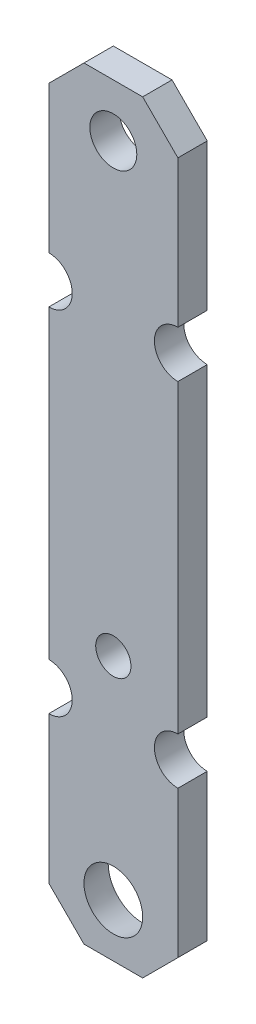
ISO-10303-21;
HEADER;
FILE_DESCRIPTION(('STEP AP214'),'2;1');
FILE_NAME('part.step','',(''),(''),'','','');
FILE_SCHEMA(('AUTOMOTIVE_DESIGN { 1 0 10303 214 1 1 1 1 }'));
ENDSEC;
DATA;
#1=APPLICATION_CONTEXT('core data for automotive mechanical design processes');
#2=APPLICATION_PROTOCOL_DEFINITION('international standard','automotive_design',2000,#1);
#3=PRODUCT_CONTEXT('',#1,'mechanical');
#4=PRODUCT('Part','Part','',(#3));
#5=PRODUCT_RELATED_PRODUCT_CATEGORY('part','',(#4));
#6=PRODUCT_DEFINITION_FORMATION('','',#4);
#7=PRODUCT_DEFINITION_CONTEXT('part definition',#1,'design');
#8=PRODUCT_DEFINITION('design','',#6,#7);
#9=PRODUCT_DEFINITION_SHAPE('','',#8);
#10=(LENGTH_UNIT() NAMED_UNIT(*) SI_UNIT(.MILLI.,.METRE.));
#11=(NAMED_UNIT(*) PLANE_ANGLE_UNIT() SI_UNIT($,.RADIAN.));
#12=(NAMED_UNIT(*) SI_UNIT($,.STERADIAN.) SOLID_ANGLE_UNIT());
#13=UNCERTAINTY_MEASURE_WITH_UNIT(LENGTH_MEASURE(1.E-05),#10,'distance_accuracy_value','');
#14=(GEOMETRIC_REPRESENTATION_CONTEXT(3) GLOBAL_UNCERTAINTY_ASSIGNED_CONTEXT((#13)) GLOBAL_UNIT_ASSIGNED_CONTEXT((#10,
#11,#12)) REPRESENTATION_CONTEXT('',''));
#15=CARTESIAN_POINT('',(0.,0.,0.));
#16=DIRECTION('',(0.,0.,1.));
#17=DIRECTION('',(1.,0.,0.));
#18=AXIS2_PLACEMENT_3D('',#15,#16,#17);
#19=CARTESIAN_POINT('',(11.,30.,5.));
#20=DIRECTION('',(0.,0.,1.));
#21=DIRECTION('',(1.,0.,0.));
#22=AXIS2_PLACEMENT_3D('',#19,#20,#21);
#23=PLANE('',#22);
#24=CARTESIAN_POINT('',(0.,-56.,5.));
#25=DIRECTION('',(0.,0.,-1.));
#26=DIRECTION('',(-1.,0.,0.));
#27=AXIS2_PLACEMENT_3D('',#24,#25,#26);
#28=CIRCLE('',#27,5.);
#29=CARTESIAN_POINT('',(-5.,-56.,5.));
#30=VERTEX_POINT('',#29);
#31=EDGE_CURVE('E365',#30,#30,#28,.T.);
#32=ORIENTED_EDGE('',*,*,#31,.T.);
#33=EDGE_LOOP('',(#32));
#34=FACE_BOUND('',#33,.T.);
#35=CARTESIAN_POINT('',(0.,56.,5.));
#36=DIRECTION('',(0.,0.,1.));
#37=DIRECTION('',(1.,0.,0.));
#38=AXIS2_PLACEMENT_3D('',#35,#36,#37);
#39=CIRCLE('',#38,4.);
#40=CARTESIAN_POINT('',(4.,56.,5.));
#41=VERTEX_POINT('',#40);
#42=EDGE_CURVE('E167',#41,#41,#39,.T.);
#43=ORIENTED_EDGE('',*,*,#42,.F.);
#44=EDGE_LOOP('',(#43));
#45=FACE_BOUND('',#44,.T.);
#46=DIRECTION('',(0.,1.,0.));
#47=VECTOR('',#46,1.);
#48=CARTESIAN_POINT('',(11.,59.,5.));
#49=LINE('',#48,#47);
#50=CARTESIAN_POINT('',(11.,34.,5.));
#51=VERTEX_POINT('',#50);
#52=CARTESIAN_POINT('',(11.,59.,5.));
#53=VERTEX_POINT('',#52);
#54=EDGE_CURVE('E201',#51,#53,#49,.T.);
#55=ORIENTED_EDGE('',*,*,#54,.T.);
#56=DIRECTION('',(-0.707106781186549,0.707106781186546,0.));
#57=VECTOR('',#56,1.);
#58=CARTESIAN_POINT('',(4.99999999999997,65.,5.));
#59=LINE('',#58,#57);
#60=CARTESIAN_POINT('',(4.99999999999997,65.,5.));
#61=VERTEX_POINT('',#60);
#62=EDGE_CURVE('E162',#53,#61,#59,.T.);
#63=ORIENTED_EDGE('',*,*,#62,.T.);
#64=DIRECTION('',(-1.,0.,0.));
#65=VECTOR('',#64,1.);
#66=CARTESIAN_POINT('',(-4.99999999999997,65.,5.));
#67=LINE('',#66,#65);
#68=CARTESIAN_POINT('',(-4.99999999999997,65.,5.));
#69=VERTEX_POINT('',#68);
#70=EDGE_CURVE('E204',#61,#69,#67,.T.);
#71=ORIENTED_EDGE('',*,*,#70,.T.);
#72=DIRECTION('',(-0.707106781186549,-0.707106781186546,0.));
#73=VECTOR('',#72,1.);
#74=CARTESIAN_POINT('',(-4.99999999999997,65.,5.));
#75=LINE('',#74,#73);
#76=CARTESIAN_POINT('',(-11.,59.,5.));
#77=VERTEX_POINT('',#76);
#78=EDGE_CURVE('E206',#69,#77,#75,.T.);
#79=ORIENTED_EDGE('',*,*,#78,.T.);
#80=DIRECTION('',(0.,-1.,0.));
#81=VECTOR('',#80,1.);
#82=CARTESIAN_POINT('',(-11.,59.,5.));
#83=LINE('',#82,#81);
#84=CARTESIAN_POINT('',(-11.,34.,5.));
#85=VERTEX_POINT('',#84);
#86=EDGE_CURVE('E208',#77,#85,#83,.T.);
#87=ORIENTED_EDGE('',*,*,#86,.T.);
#88=CARTESIAN_POINT('',(-11.,30.,5.));
#89=DIRECTION('',(0.,0.,-1.));
#90=DIRECTION('',(-1.,0.,0.));
#91=AXIS2_PLACEMENT_3D('',#88,#89,#90);
#92=CIRCLE('',#91,4.);
#93=CARTESIAN_POINT('',(-11.,26.,5.));
#94=VERTEX_POINT('',#93);
#95=EDGE_CURVE('E210',#85,#94,#92,.T.);
#96=ORIENTED_EDGE('',*,*,#95,.T.);
#97=DIRECTION('',(0.,-1.,0.));
#98=VECTOR('',#97,1.);
#99=CARTESIAN_POINT('',(-11.,26.,5.));
#100=LINE('',#99,#98);
#101=CARTESIAN_POINT('',(-11.,-26.,5.));
#102=VERTEX_POINT('',#101);
#103=EDGE_CURVE('E212',#94,#102,#100,.T.);
#104=ORIENTED_EDGE('',*,*,#103,.T.);
#105=CARTESIAN_POINT('',(-11.,-30.,5.));
#106=DIRECTION('',(0.,0.,-1.));
#107=DIRECTION('',(1.,0.,0.));
#108=AXIS2_PLACEMENT_3D('',#105,#106,#107);
#109=CIRCLE('',#108,4.);
#110=CARTESIAN_POINT('',(-11.,-34.,5.));
#111=VERTEX_POINT('',#110);
#112=EDGE_CURVE('E214',#102,#111,#109,.T.);
#113=ORIENTED_EDGE('',*,*,#112,.T.);
#114=DIRECTION('',(0.,-1.,0.));
#115=VECTOR('',#114,1.);
#116=CARTESIAN_POINT('',(-11.,-59.,5.));
#117=LINE('',#116,#115);
#118=CARTESIAN_POINT('',(-11.,-59.,5.));
#119=VERTEX_POINT('',#118);
#120=EDGE_CURVE('E216',#111,#119,#117,.T.);
#121=ORIENTED_EDGE('',*,*,#120,.T.);
#122=DIRECTION('',(0.707106781186549,-0.707106781186546,0.));
#123=VECTOR('',#122,1.);
#124=CARTESIAN_POINT('',(-4.99999999999997,-65.,5.));
#125=LINE('',#124,#123);
#126=CARTESIAN_POINT('',(-4.99999999999997,-65.,5.));
#127=VERTEX_POINT('',#126);
#128=EDGE_CURVE('E218',#119,#127,#125,.T.);
#129=ORIENTED_EDGE('',*,*,#128,.T.);
#130=DIRECTION('',(1.,0.,0.));
#131=VECTOR('',#130,1.);
#132=CARTESIAN_POINT('',(-4.99999999999997,-65.,5.));
#133=LINE('',#132,#131);
#134=CARTESIAN_POINT('',(4.99999999999997,-65.,5.));
#135=VERTEX_POINT('',#134);
#136=EDGE_CURVE('E220',#127,#135,#133,.T.);
#137=ORIENTED_EDGE('',*,*,#136,.T.);
#138=DIRECTION('',(0.707106781186549,0.707106781186546,0.));
#139=VECTOR('',#138,1.);
#140=CARTESIAN_POINT('',(4.99999999999997,-65.,5.));
#141=LINE('',#140,#139);
#142=CARTESIAN_POINT('',(11.,-59.,5.));
#143=VERTEX_POINT('',#142);
#144=EDGE_CURVE('E222',#135,#143,#141,.T.);
#145=ORIENTED_EDGE('',*,*,#144,.T.);
#146=DIRECTION('',(0.,1.,0.));
#147=VECTOR('',#146,1.);
#148=CARTESIAN_POINT('',(11.,-59.,5.));
#149=LINE('',#148,#147);
#150=CARTESIAN_POINT('',(11.,-34.,5.));
#151=VERTEX_POINT('',#150);
#152=EDGE_CURVE('E224',#143,#151,#149,.T.);
#153=ORIENTED_EDGE('',*,*,#152,.T.);
#154=CARTESIAN_POINT('',(11.,-30.,5.));
#155=DIRECTION('',(0.,0.,-1.));
#156=DIRECTION('',(-1.,0.,0.));
#157=AXIS2_PLACEMENT_3D('',#154,#155,#156);
#158=CIRCLE('',#157,4.);
#159=CARTESIAN_POINT('',(11.,-26.,5.));
#160=VERTEX_POINT('',#159);
#161=EDGE_CURVE('E226',#151,#160,#158,.T.);
#162=ORIENTED_EDGE('',*,*,#161,.T.);
#163=DIRECTION('',(0.,1.,0.));
#164=VECTOR('',#163,1.);
#165=CARTESIAN_POINT('',(11.,26.,5.));
#166=LINE('',#165,#164);
#167=CARTESIAN_POINT('',(11.,26.,5.));
#168=VERTEX_POINT('',#167);
#169=EDGE_CURVE('E55',#160,#168,#166,.T.);
#170=ORIENTED_EDGE('',*,*,#169,.T.);
#171=CARTESIAN_POINT('',(11.,30.,5.));
#172=DIRECTION('',(0.,0.,-1.));
#173=DIRECTION('',(1.,0.,0.));
#174=AXIS2_PLACEMENT_3D('',#171,#172,#173);
#175=CIRCLE('',#174,4.);
#176=EDGE_CURVE('E50',#168,#51,#175,.T.);
#177=ORIENTED_EDGE('',*,*,#176,.T.);
#178=EDGE_LOOP('',(#55,#63,#71,#79,#87,#96,#104,#113,#121,#129,#137,#145,#153,#162,#170,#177));
#179=FACE_BOUND('',#178,.T.);
#180=CARTESIAN_POINT('',(0.,-20.,5.));
#181=DIRECTION('',(0.,0.,1.));
#182=DIRECTION('',(1.,0.,0.));
#183=AXIS2_PLACEMENT_3D('',#180,#181,#182);
#184=CIRCLE('',#183,3.);
#185=CARTESIAN_POINT('',(3.,-20.,5.));
#186=VERTEX_POINT('',#185);
#187=EDGE_CURVE('E372',#186,#186,#184,.T.);
#188=ORIENTED_EDGE('',*,*,#187,.F.);
#189=EDGE_LOOP('',(#188));
#190=FACE_BOUND('',#189,.T.);
#191=ADVANCED_FACE('F35',(#34,#45,#179,#190),#23,.T.);
#192=CARTESIAN_POINT('',(11.,30.,0.));
#193=DIRECTION('',(0.,0.,1.));
#194=DIRECTION('',(1.,0.,0.));
#195=AXIS2_PLACEMENT_3D('',#192,#193,#194);
#196=PLANE('',#195);
#197=CARTESIAN_POINT('',(0.,-56.,0.));
#198=DIRECTION('',(0.,0.,-1.));
#199=DIRECTION('',(-1.,0.,0.));
#200=AXIS2_PLACEMENT_3D('',#197,#198,#199);
#201=CIRCLE('',#200,5.88163490354229);
#202=CARTESIAN_POINT('',(-5.88163490354229,-56.,0.));
#203=VERTEX_POINT('',#202);
#204=EDGE_CURVE('E368',#203,#203,#201,.T.);
#205=ORIENTED_EDGE('',*,*,#204,.F.);
#206=EDGE_LOOP('',(#205));
#207=FACE_BOUND('',#206,.T.);
#208=CARTESIAN_POINT('',(0.,56.,0.));
#209=DIRECTION('',(0.,0.,1.));
#210=DIRECTION('',(1.,0.,0.));
#211=AXIS2_PLACEMENT_3D('',#208,#209,#210);
#212=CIRCLE('',#211,4.);
#213=CARTESIAN_POINT('',(4.,56.,0.));
#214=VERTEX_POINT('',#213);
#215=EDGE_CURVE('E170',#214,#214,#212,.T.);
#216=ORIENTED_EDGE('',*,*,#215,.T.);
#217=EDGE_LOOP('',(#216));
#218=FACE_BOUND('',#217,.T.);
#219=DIRECTION('',(0.,1.,0.));
#220=VECTOR('',#219,1.);
#221=CARTESIAN_POINT('',(11.,59.,0.));
#222=LINE('',#221,#220);
#223=CARTESIAN_POINT('',(11.,34.,0.));
#224=VERTEX_POINT('',#223);
#225=CARTESIAN_POINT('',(11.,59.,0.));
#226=VERTEX_POINT('',#225);
#227=EDGE_CURVE('E153',#224,#226,#222,.T.);
#228=ORIENTED_EDGE('',*,*,#227,.F.);
#229=CARTESIAN_POINT('',(11.,30.,0.));
#230=DIRECTION('',(0.,0.,-1.));
#231=DIRECTION('',(1.,0.,0.));
#232=AXIS2_PLACEMENT_3D('',#229,#230,#231);
#233=CIRCLE('',#232,4.);
#234=CARTESIAN_POINT('',(11.,26.,0.));
#235=VERTEX_POINT('',#234);
#236=EDGE_CURVE('E199',#235,#224,#233,.T.);
#237=ORIENTED_EDGE('',*,*,#236,.F.);
#238=DIRECTION('',(0.,1.,0.));
#239=VECTOR('',#238,1.);
#240=CARTESIAN_POINT('',(11.,26.,0.));
#241=LINE('',#240,#239);
#242=CARTESIAN_POINT('',(11.,-26.,0.));
#243=VERTEX_POINT('',#242);
#244=EDGE_CURVE('E197',#243,#235,#241,.T.);
#245=ORIENTED_EDGE('',*,*,#244,.F.);
#246=CARTESIAN_POINT('',(11.,-30.,0.));
#247=DIRECTION('',(0.,0.,-1.));
#248=DIRECTION('',(-1.,0.,0.));
#249=AXIS2_PLACEMENT_3D('',#246,#247,#248);
#250=CIRCLE('',#249,4.);
#251=CARTESIAN_POINT('',(11.,-34.,0.));
#252=VERTEX_POINT('',#251);
#253=EDGE_CURVE('E195',#252,#243,#250,.T.);
#254=ORIENTED_EDGE('',*,*,#253,.F.);
#255=DIRECTION('',(0.,1.,0.));
#256=VECTOR('',#255,1.);
#257=CARTESIAN_POINT('',(11.,-59.,0.));
#258=LINE('',#257,#256);
#259=CARTESIAN_POINT('',(11.,-59.,0.));
#260=VERTEX_POINT('',#259);
#261=EDGE_CURVE('E193',#260,#252,#258,.T.);
#262=ORIENTED_EDGE('',*,*,#261,.F.);
#263=DIRECTION('',(0.707106781186549,0.707106781186546,0.));
#264=VECTOR('',#263,1.);
#265=CARTESIAN_POINT('',(4.99999999999997,-65.,0.));
#266=LINE('',#265,#264);
#267=CARTESIAN_POINT('',(4.99999999999997,-65.,0.));
#268=VERTEX_POINT('',#267);
#269=EDGE_CURVE('E191',#268,#260,#266,.T.);
#270=ORIENTED_EDGE('',*,*,#269,.F.);
#271=DIRECTION('',(1.,0.,0.));
#272=VECTOR('',#271,1.);
#273=CARTESIAN_POINT('',(-4.99999999999997,-65.,0.));
#274=LINE('',#273,#272);
#275=CARTESIAN_POINT('',(-4.99999999999997,-65.,0.));
#276=VERTEX_POINT('',#275);
#277=EDGE_CURVE('E189',#276,#268,#274,.T.);
#278=ORIENTED_EDGE('',*,*,#277,.F.);
#279=DIRECTION('',(0.707106781186549,-0.707106781186546,0.));
#280=VECTOR('',#279,1.);
#281=CARTESIAN_POINT('',(-4.99999999999997,-65.,0.));
#282=LINE('',#281,#280);
#283=CARTESIAN_POINT('',(-11.,-59.,0.));
#284=VERTEX_POINT('',#283);
#285=EDGE_CURVE('E187',#284,#276,#282,.T.);
#286=ORIENTED_EDGE('',*,*,#285,.F.);
#287=DIRECTION('',(0.,-1.,0.));
#288=VECTOR('',#287,1.);
#289=CARTESIAN_POINT('',(-11.,-59.,0.));
#290=LINE('',#289,#288);
#291=CARTESIAN_POINT('',(-11.,-34.,0.));
#292=VERTEX_POINT('',#291);
#293=EDGE_CURVE('E185',#292,#284,#290,.T.);
#294=ORIENTED_EDGE('',*,*,#293,.F.);
#295=CARTESIAN_POINT('',(-11.,-30.,0.));
#296=DIRECTION('',(0.,0.,-1.));
#297=DIRECTION('',(1.,0.,0.));
#298=AXIS2_PLACEMENT_3D('',#295,#296,#297);
#299=CIRCLE('',#298,4.);
#300=CARTESIAN_POINT('',(-11.,-26.,0.));
#301=VERTEX_POINT('',#300);
#302=EDGE_CURVE('E183',#301,#292,#299,.T.);
#303=ORIENTED_EDGE('',*,*,#302,.F.);
#304=DIRECTION('',(0.,-1.,0.));
#305=VECTOR('',#304,1.);
#306=CARTESIAN_POINT('',(-11.,26.,0.));
#307=LINE('',#306,#305);
#308=CARTESIAN_POINT('',(-11.,26.,0.));
#309=VERTEX_POINT('',#308);
#310=EDGE_CURVE('E181',#309,#301,#307,.T.);
#311=ORIENTED_EDGE('',*,*,#310,.F.);
#312=CARTESIAN_POINT('',(-11.,30.,0.));
#313=DIRECTION('',(0.,0.,-1.));
#314=DIRECTION('',(-1.,0.,0.));
#315=AXIS2_PLACEMENT_3D('',#312,#313,#314);
#316=CIRCLE('',#315,4.);
#317=CARTESIAN_POINT('',(-11.,34.,0.));
#318=VERTEX_POINT('',#317);
#319=EDGE_CURVE('E179',#318,#309,#316,.T.);
#320=ORIENTED_EDGE('',*,*,#319,.F.);
#321=DIRECTION('',(0.,-1.,0.));
#322=VECTOR('',#321,1.);
#323=CARTESIAN_POINT('',(-11.,59.,0.));
#324=LINE('',#323,#322);
#325=CARTESIAN_POINT('',(-11.,59.,0.));
#326=VERTEX_POINT('',#325);
#327=EDGE_CURVE('E177',#326,#318,#324,.T.);
#328=ORIENTED_EDGE('',*,*,#327,.F.);
#329=DIRECTION('',(-0.707106781186549,-0.707106781186546,0.));
#330=VECTOR('',#329,1.);
#331=CARTESIAN_POINT('',(-4.99999999999997,65.,0.));
#332=LINE('',#331,#330);
#333=CARTESIAN_POINT('',(-4.99999999999997,65.,0.));
#334=VERTEX_POINT('',#333);
#335=EDGE_CURVE('E175',#334,#326,#332,.T.);
#336=ORIENTED_EDGE('',*,*,#335,.F.);
#337=DIRECTION('',(-1.,0.,0.));
#338=VECTOR('',#337,1.);
#339=CARTESIAN_POINT('',(-4.99999999999997,65.,0.));
#340=LINE('',#339,#338);
#341=CARTESIAN_POINT('',(4.99999999999997,65.,0.));
#342=VERTEX_POINT('',#341);
#343=EDGE_CURVE('E155',#342,#334,#340,.T.);
#344=ORIENTED_EDGE('',*,*,#343,.F.);
#345=DIRECTION('',(-0.707106781186549,0.707106781186546,0.));
#346=VECTOR('',#345,1.);
#347=CARTESIAN_POINT('',(4.99999999999997,65.,0.));
#348=LINE('',#347,#346);
#349=EDGE_CURVE('E148',#226,#342,#348,.T.);
#350=ORIENTED_EDGE('',*,*,#349,.F.);
#351=EDGE_LOOP('',(#228,#237,#245,#254,#262,#270,#278,#286,#294,#303,#311,#320,#328,#336,#344,#350));
#352=FACE_BOUND('',#351,.T.);
#353=CARTESIAN_POINT('',(0.,-20.,0.));
#354=DIRECTION('',(0.,0.,1.));
#355=DIRECTION('',(1.,0.,0.));
#356=AXIS2_PLACEMENT_3D('',#353,#354,#355);
#357=CIRCLE('',#356,3.);
#358=CARTESIAN_POINT('',(3.,-20.,0.));
#359=VERTEX_POINT('',#358);
#360=EDGE_CURVE('E369',#359,#359,#357,.T.);
#361=ORIENTED_EDGE('',*,*,#360,.T.);
#362=EDGE_LOOP('',(#361));
#363=FACE_BOUND('',#362,.T.);
#364=ADVANCED_FACE('F149',(#207,#218,#352,#363),#196,.F.);
#365=CARTESIAN_POINT('',(11.,59.,5.));
#366=DIRECTION('',(-1.,0.,0.));
#367=DIRECTION('',(0.,-1.,0.));
#368=AXIS2_PLACEMENT_3D('',#365,#366,#367);
#369=PLANE('',#368);
#370=ORIENTED_EDGE('',*,*,#227,.T.);
#371=DIRECTION('',(0.,0.,-1.));
#372=VECTOR('',#371,1.);
#373=CARTESIAN_POINT('',(11.,59.,5.));
#374=LINE('',#373,#372);
#375=EDGE_CURVE('E11',#53,#226,#374,.T.);
#376=ORIENTED_EDGE('',*,*,#375,.F.);
#377=ORIENTED_EDGE('',*,*,#54,.F.);
#378=DIRECTION('',(0.,0.,-1.));
#379=VECTOR('',#378,1.);
#380=CARTESIAN_POINT('',(11.,34.,5.));
#381=LINE('',#380,#379);
#382=EDGE_CURVE('E166',#51,#224,#381,.T.);
#383=ORIENTED_EDGE('',*,*,#382,.T.);
#384=EDGE_LOOP('',(#370,#376,#377,#383));
#385=FACE_BOUND('',#384,.T.);
#386=ADVANCED_FACE('F37',(#385),#369,.F.);
#387=CARTESIAN_POINT('',(4.99999999999997,65.,5.));
#388=DIRECTION('',(-0.707106781186546,-0.707106781186549,0.));
#389=DIRECTION('',(0.707106781186549,-0.707106781186546,0.));
#390=AXIS2_PLACEMENT_3D('',#387,#388,#389);
#391=PLANE('',#390);
#392=ORIENTED_EDGE('',*,*,#349,.T.);
#393=DIRECTION('',(0.,0.,-1.));
#394=VECTOR('',#393,1.);
#395=CARTESIAN_POINT('',(4.99999999999997,65.,5.));
#396=LINE('',#395,#394);
#397=EDGE_CURVE('E43',#61,#342,#396,.T.);
#398=ORIENTED_EDGE('',*,*,#397,.F.);
#399=ORIENTED_EDGE('',*,*,#62,.F.);
#400=ORIENTED_EDGE('',*,*,#375,.T.);
#401=EDGE_LOOP('',(#392,#398,#399,#400));
#402=FACE_BOUND('',#401,.T.);
#403=ADVANCED_FACE('F161',(#402),#391,.F.);
#404=CARTESIAN_POINT('',(-4.99999999999997,65.,5.));
#405=DIRECTION('',(0.,-1.,0.));
#406=DIRECTION('',(0.,0.,-1.));
#407=AXIS2_PLACEMENT_3D('',#404,#405,#406);
#408=PLANE('',#407);
#409=ORIENTED_EDGE('',*,*,#343,.T.);
#410=DIRECTION('',(0.,0.,-1.));
#411=VECTOR('',#410,1.);
#412=CARTESIAN_POINT('',(-4.99999999999997,65.,5.));
#413=LINE('',#412,#411);
#414=EDGE_CURVE('E267',#69,#334,#413,.T.);
#415=ORIENTED_EDGE('',*,*,#414,.F.);
#416=ORIENTED_EDGE('',*,*,#70,.F.);
#417=ORIENTED_EDGE('',*,*,#397,.T.);
#418=EDGE_LOOP('',(#409,#415,#416,#417));
#419=FACE_BOUND('',#418,.T.);
#420=ADVANCED_FACE('F271',(#419),#408,.F.);
#421=CARTESIAN_POINT('',(-4.99999999999997,65.,5.));
#422=DIRECTION('',(0.707106781186546,-0.707106781186549,0.));
#423=DIRECTION('',(0.707106781186549,0.707106781186546,0.));
#424=AXIS2_PLACEMENT_3D('',#421,#422,#423);
#425=PLANE('',#424);
#426=ORIENTED_EDGE('',*,*,#335,.T.);
#427=DIRECTION('',(0.,0.,-1.));
#428=VECTOR('',#427,1.);
#429=CARTESIAN_POINT('',(-11.,59.,5.));
#430=LINE('',#429,#428);
#431=EDGE_CURVE('E264',#77,#326,#430,.T.);
#432=ORIENTED_EDGE('',*,*,#431,.F.);
#433=ORIENTED_EDGE('',*,*,#78,.F.);
#434=ORIENTED_EDGE('',*,*,#414,.T.);
#435=EDGE_LOOP('',(#426,#432,#433,#434));
#436=FACE_BOUND('',#435,.T.);
#437=ADVANCED_FACE('F279',(#436),#425,.F.);
#438=CARTESIAN_POINT('',(-11.,59.,5.));
#439=DIRECTION('',(1.,0.,0.));
#440=DIRECTION('',(0.,1.,0.));
#441=AXIS2_PLACEMENT_3D('',#438,#439,#440);
#442=PLANE('',#441);
#443=ORIENTED_EDGE('',*,*,#327,.T.);
#444=DIRECTION('',(0.,0.,-1.));
#445=VECTOR('',#444,1.);
#446=CARTESIAN_POINT('',(-11.,34.,5.));
#447=LINE('',#446,#445);
#448=EDGE_CURVE('E261',#85,#318,#447,.T.);
#449=ORIENTED_EDGE('',*,*,#448,.F.);
#450=ORIENTED_EDGE('',*,*,#86,.F.);
#451=ORIENTED_EDGE('',*,*,#431,.T.);
#452=EDGE_LOOP('',(#443,#449,#450,#451));
#453=FACE_BOUND('',#452,.T.);
#454=ADVANCED_FACE('F282',(#453),#442,.F.);
#455=CARTESIAN_POINT('',(-11.,30.,5.));
#456=DIRECTION('',(0.,0.,-1.));
#457=DIRECTION('',(-1.,0.,0.));
#458=AXIS2_PLACEMENT_3D('',#455,#456,#457);
#459=CYLINDRICAL_SURFACE('',#458,4.);
#460=ORIENTED_EDGE('',*,*,#319,.T.);
#461=DIRECTION('',(0.,0.,-1.));
#462=VECTOR('',#461,1.);
#463=CARTESIAN_POINT('',(-11.,26.,5.));
#464=LINE('',#463,#462);
#465=EDGE_CURVE('E258',#94,#309,#464,.T.);
#466=ORIENTED_EDGE('',*,*,#465,.F.);
#467=ORIENTED_EDGE('',*,*,#95,.F.);
#468=ORIENTED_EDGE('',*,*,#448,.T.);
#469=EDGE_LOOP('',(#460,#466,#467,#468));
#470=FACE_BOUND('',#469,.T.);
#471=ADVANCED_FACE('F287',(#470),#459,.F.);
#472=CARTESIAN_POINT('',(-11.,26.,5.));
#473=DIRECTION('',(1.,0.,0.));
#474=DIRECTION('',(0.,0.,-1.));
#475=AXIS2_PLACEMENT_3D('',#472,#473,#474);
#476=PLANE('',#475);
#477=ORIENTED_EDGE('',*,*,#310,.T.);
#478=DIRECTION('',(0.,0.,-1.));
#479=VECTOR('',#478,1.);
#480=CARTESIAN_POINT('',(-11.,-26.,5.));
#481=LINE('',#480,#479);
#482=EDGE_CURVE('E255',#102,#301,#481,.T.);
#483=ORIENTED_EDGE('',*,*,#482,.F.);
#484=ORIENTED_EDGE('',*,*,#103,.F.);
#485=ORIENTED_EDGE('',*,*,#465,.T.);
#486=EDGE_LOOP('',(#477,#483,#484,#485));
#487=FACE_BOUND('',#486,.T.);
#488=ADVANCED_FACE('F293',(#487),#476,.F.);
#489=CARTESIAN_POINT('',(-11.,-30.,5.));
#490=DIRECTION('',(0.,0.,-1.));
#491=DIRECTION('',(-1.,0.,0.));
#492=AXIS2_PLACEMENT_3D('',#489,#490,#491);
#493=CYLINDRICAL_SURFACE('',#492,4.);
#494=ORIENTED_EDGE('',*,*,#302,.T.);
#495=DIRECTION('',(0.,0.,-1.));
#496=VECTOR('',#495,1.);
#497=CARTESIAN_POINT('',(-11.,-34.,5.));
#498=LINE('',#497,#496);
#499=EDGE_CURVE('E252',#111,#292,#498,.T.);
#500=ORIENTED_EDGE('',*,*,#499,.F.);
#501=ORIENTED_EDGE('',*,*,#112,.F.);
#502=ORIENTED_EDGE('',*,*,#482,.T.);
#503=EDGE_LOOP('',(#494,#500,#501,#502));
#504=FACE_BOUND('',#503,.T.);
#505=ADVANCED_FACE('F297',(#504),#493,.F.);
#506=CARTESIAN_POINT('',(-11.,-59.,5.));
#507=DIRECTION('',(1.,0.,0.));
#508=DIRECTION('',(0.,1.,0.));
#509=AXIS2_PLACEMENT_3D('',#506,#507,#508);
#510=PLANE('',#509);
#511=ORIENTED_EDGE('',*,*,#293,.T.);
#512=DIRECTION('',(0.,0.,-1.));
#513=VECTOR('',#512,1.);
#514=CARTESIAN_POINT('',(-11.,-59.,5.));
#515=LINE('',#514,#513);
#516=EDGE_CURVE('E249',#119,#284,#515,.T.);
#517=ORIENTED_EDGE('',*,*,#516,.F.);
#518=ORIENTED_EDGE('',*,*,#120,.F.);
#519=ORIENTED_EDGE('',*,*,#499,.T.);
#520=EDGE_LOOP('',(#511,#517,#518,#519));
#521=FACE_BOUND('',#520,.T.);
#522=ADVANCED_FACE('F302',(#521),#510,.F.);
#523=CARTESIAN_POINT('',(-4.99999999999997,-65.,5.));
#524=DIRECTION('',(0.707106781186546,0.707106781186549,0.));
#525=DIRECTION('',(-0.707106781186549,0.707106781186546,0.));
#526=AXIS2_PLACEMENT_3D('',#523,#524,#525);
#527=PLANE('',#526);
#528=ORIENTED_EDGE('',*,*,#285,.T.);
#529=DIRECTION('',(0.,0.,-1.));
#530=VECTOR('',#529,1.);
#531=CARTESIAN_POINT('',(-4.99999999999997,-65.,5.));
#532=LINE('',#531,#530);
#533=EDGE_CURVE('E246',#127,#276,#532,.T.);
#534=ORIENTED_EDGE('',*,*,#533,.F.);
#535=ORIENTED_EDGE('',*,*,#128,.F.);
#536=ORIENTED_EDGE('',*,*,#516,.T.);
#537=EDGE_LOOP('',(#528,#534,#535,#536));
#538=FACE_BOUND('',#537,.T.);
#539=ADVANCED_FACE('F308',(#538),#527,.F.);
#540=CARTESIAN_POINT('',(-4.99999999999997,-65.,5.));
#541=DIRECTION('',(0.,1.,0.));
#542=DIRECTION('',(0.,0.,1.));
#543=AXIS2_PLACEMENT_3D('',#540,#541,#542);
#544=PLANE('',#543);
#545=ORIENTED_EDGE('',*,*,#277,.T.);
#546=DIRECTION('',(0.,0.,-1.));
#547=VECTOR('',#546,1.);
#548=CARTESIAN_POINT('',(4.99999999999997,-65.,5.));
#549=LINE('',#548,#547);
#550=EDGE_CURVE('E243',#135,#268,#549,.T.);
#551=ORIENTED_EDGE('',*,*,#550,.F.);
#552=ORIENTED_EDGE('',*,*,#136,.F.);
#553=ORIENTED_EDGE('',*,*,#533,.T.);
#554=EDGE_LOOP('',(#545,#551,#552,#553));
#555=FACE_BOUND('',#554,.T.);
#556=ADVANCED_FACE('F312',(#555),#544,.F.);
#557=CARTESIAN_POINT('',(4.99999999999997,-65.,5.));
#558=DIRECTION('',(-0.707106781186546,0.707106781186549,0.));
#559=DIRECTION('',(-0.707106781186549,-0.707106781186546,0.));
#560=AXIS2_PLACEMENT_3D('',#557,#558,#559);
#561=PLANE('',#560);
#562=ORIENTED_EDGE('',*,*,#269,.T.);
#563=DIRECTION('',(0.,0.,-1.));
#564=VECTOR('',#563,1.);
#565=CARTESIAN_POINT('',(11.,-59.,5.));
#566=LINE('',#565,#564);
#567=EDGE_CURVE('E240',#143,#260,#566,.T.);
#568=ORIENTED_EDGE('',*,*,#567,.F.);
#569=ORIENTED_EDGE('',*,*,#144,.F.);
#570=ORIENTED_EDGE('',*,*,#550,.T.);
#571=EDGE_LOOP('',(#562,#568,#569,#570));
#572=FACE_BOUND('',#571,.T.);
#573=ADVANCED_FACE('F317',(#572),#561,.F.);
#574=CARTESIAN_POINT('',(11.,-59.,5.));
#575=DIRECTION('',(-1.,0.,0.));
#576=DIRECTION('',(0.,-1.,0.));
#577=AXIS2_PLACEMENT_3D('',#574,#575,#576);
#578=PLANE('',#577);
#579=ORIENTED_EDGE('',*,*,#261,.T.);
#580=DIRECTION('',(0.,0.,-1.));
#581=VECTOR('',#580,1.);
#582=CARTESIAN_POINT('',(11.,-34.,5.));
#583=LINE('',#582,#581);
#584=EDGE_CURVE('E237',#151,#252,#583,.T.);
#585=ORIENTED_EDGE('',*,*,#584,.F.);
#586=ORIENTED_EDGE('',*,*,#152,.F.);
#587=ORIENTED_EDGE('',*,*,#567,.T.);
#588=EDGE_LOOP('',(#579,#585,#586,#587));
#589=FACE_BOUND('',#588,.T.);
#590=ADVANCED_FACE('F323',(#589),#578,.F.);
#591=CARTESIAN_POINT('',(11.,-30.,5.));
#592=DIRECTION('',(0.,0.,-1.));
#593=DIRECTION('',(-1.,0.,0.));
#594=AXIS2_PLACEMENT_3D('',#591,#592,#593);
#595=CYLINDRICAL_SURFACE('',#594,4.);
#596=ORIENTED_EDGE('',*,*,#253,.T.);
#597=DIRECTION('',(0.,0.,-1.));
#598=VECTOR('',#597,1.);
#599=CARTESIAN_POINT('',(11.,-26.,5.));
#600=LINE('',#599,#598);
#601=EDGE_CURVE('E234',#160,#243,#600,.T.);
#602=ORIENTED_EDGE('',*,*,#601,.F.);
#603=ORIENTED_EDGE('',*,*,#161,.F.);
#604=ORIENTED_EDGE('',*,*,#584,.T.);
#605=EDGE_LOOP('',(#596,#602,#603,#604));
#606=FACE_BOUND('',#605,.T.);
#607=ADVANCED_FACE('F327',(#606),#595,.F.);
#608=CARTESIAN_POINT('',(11.,26.,5.));
#609=DIRECTION('',(-1.,0.,0.));
#610=DIRECTION('',(0.,0.,1.));
#611=AXIS2_PLACEMENT_3D('',#608,#609,#610);
#612=PLANE('',#611);
#613=ORIENTED_EDGE('',*,*,#244,.T.);
#614=DIRECTION('',(0.,0.,-1.));
#615=VECTOR('',#614,1.);
#616=CARTESIAN_POINT('',(11.,26.,5.));
#617=LINE('',#616,#615);
#618=EDGE_CURVE('E231',#168,#235,#617,.T.);
#619=ORIENTED_EDGE('',*,*,#618,.F.);
#620=ORIENTED_EDGE('',*,*,#169,.F.);
#621=ORIENTED_EDGE('',*,*,#601,.T.);
#622=EDGE_LOOP('',(#613,#619,#620,#621));
#623=FACE_BOUND('',#622,.T.);
#624=ADVANCED_FACE('F330',(#623),#612,.F.);
#625=CARTESIAN_POINT('',(11.,30.,5.));
#626=DIRECTION('',(0.,0.,-1.));
#627=DIRECTION('',(-1.,0.,0.));
#628=AXIS2_PLACEMENT_3D('',#625,#626,#627);
#629=CYLINDRICAL_SURFACE('',#628,4.);
#630=ORIENTED_EDGE('',*,*,#236,.T.);
#631=ORIENTED_EDGE('',*,*,#382,.F.);
#632=ORIENTED_EDGE('',*,*,#176,.F.);
#633=ORIENTED_EDGE('',*,*,#618,.T.);
#634=EDGE_LOOP('',(#630,#631,#632,#633));
#635=FACE_BOUND('',#634,.T.);
#636=ADVANCED_FACE('F332',(#635),#629,.F.);
#637=CARTESIAN_POINT('',(0.,56.,5.));
#638=DIRECTION('',(0.,0.,-1.));
#639=DIRECTION('',(-1.,0.,0.));
#640=AXIS2_PLACEMENT_3D('',#637,#638,#639);
#641=CYLINDRICAL_SURFACE('',#640,4.);
#642=ORIENTED_EDGE('',*,*,#42,.T.);
#643=EDGE_LOOP('',(#642));
#644=FACE_BOUND('',#643,.T.);
#645=ORIENTED_EDGE('',*,*,#215,.F.);
#646=EDGE_LOOP('',(#645));
#647=FACE_BOUND('',#646,.T.);
#648=ADVANCED_FACE('F334',(#644,#647),#641,.F.);
#649=CARTESIAN_POINT('',(0.,-20.,5.));
#650=DIRECTION('',(0.,0.,-1.));
#651=DIRECTION('',(-1.,0.,0.));
#652=AXIS2_PLACEMENT_3D('',#649,#650,#651);
#653=CYLINDRICAL_SURFACE('',#652,3.);
#654=ORIENTED_EDGE('',*,*,#187,.T.);
#655=EDGE_LOOP('',(#654));
#656=FACE_BOUND('',#655,.T.);
#657=ORIENTED_EDGE('',*,*,#360,.F.);
#658=EDGE_LOOP('',(#657));
#659=FACE_BOUND('',#658,.T.);
#660=ADVANCED_FACE('F340',(#656,#659),#653,.F.);
#661=CARTESIAN_POINT('',(0.,-56.,0.));
#662=DIRECTION('',(0.,0.,-1.));
#663=DIRECTION('',(-1.,0.,0.));
#664=AXIS2_PLACEMENT_3D('',#661,#662,#663);
#665=CONICAL_SURFACE('',#664,5.88163490354229,0.174532925199426);
#666=ORIENTED_EDGE('',*,*,#31,.F.);
#667=EDGE_LOOP('',(#666));
#668=FACE_BOUND('',#667,.T.);
#669=ORIENTED_EDGE('',*,*,#204,.T.);
#670=EDGE_LOOP('',(#669));
#671=FACE_BOUND('',#670,.T.);
#672=ADVANCED_FACE('F357',(#668,#671),#665,.F.);
#673=CLOSED_SHELL('',(#191,#364,#386,#403,#420,#437,#454,#471,#488,#505,#522,#539,#556,#573,
#590,#607,#624,#636,#648,#660,#672));
#674=MANIFOLD_SOLID_BREP('B2',#673);
#675=ADVANCED_BREP_SHAPE_REPRESENTATION('',(#18,#674),#14);
#676=SHAPE_DEFINITION_REPRESENTATION(#9,#675);
ENDSEC;
END-ISO-10303-21;
